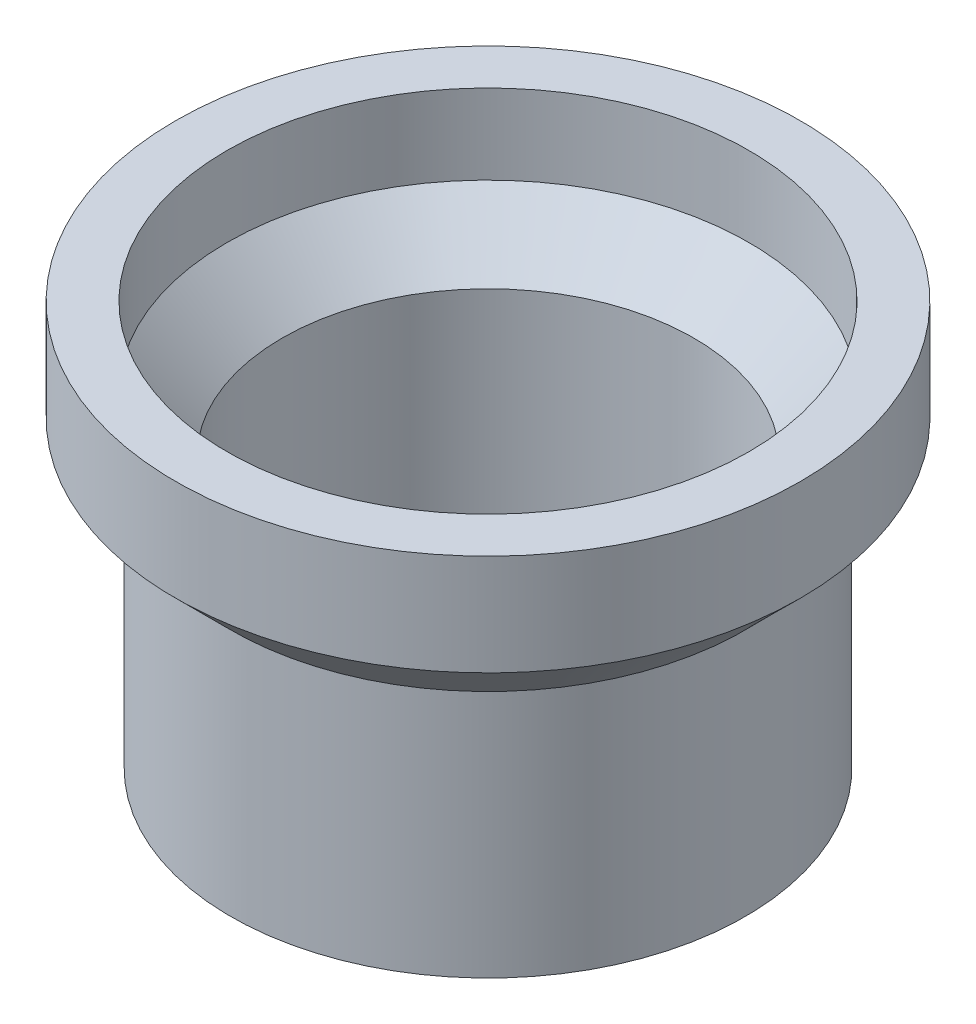
ISO-10303-21;
HEADER;
FILE_DESCRIPTION(('STEP AP214'),'2;1');
FILE_NAME('part.step','',(''),(''),'','','');
FILE_SCHEMA(('AUTOMOTIVE_DESIGN { 1 0 10303 214 1 1 1 1 }'));
ENDSEC;
DATA;
#1=APPLICATION_CONTEXT('core data for automotive mechanical design processes');
#2=APPLICATION_PROTOCOL_DEFINITION('international standard','automotive_design',2000,#1);
#3=PRODUCT_CONTEXT('',#1,'mechanical');
#4=PRODUCT('Part','Part','',(#3));
#5=PRODUCT_RELATED_PRODUCT_CATEGORY('part','',(#4));
#6=PRODUCT_DEFINITION_FORMATION('','',#4);
#7=PRODUCT_DEFINITION_CONTEXT('part definition',#1,'design');
#8=PRODUCT_DEFINITION('design','',#6,#7);
#9=PRODUCT_DEFINITION_SHAPE('','',#8);
#10=(LENGTH_UNIT() NAMED_UNIT(*) SI_UNIT(.MILLI.,.METRE.));
#11=(NAMED_UNIT(*) PLANE_ANGLE_UNIT() SI_UNIT($,.RADIAN.));
#12=(NAMED_UNIT(*) SI_UNIT($,.STERADIAN.) SOLID_ANGLE_UNIT());
#13=UNCERTAINTY_MEASURE_WITH_UNIT(LENGTH_MEASURE(1.E-05),#10,'distance_accuracy_value','');
#14=(GEOMETRIC_REPRESENTATION_CONTEXT(3) GLOBAL_UNCERTAINTY_ASSIGNED_CONTEXT((#13)) GLOBAL_UNIT_ASSIGNED_CONTEXT((#10,
#11,#12)) REPRESENTATION_CONTEXT('',''));
#15=CARTESIAN_POINT('',(0.,0.,0.));
#16=DIRECTION('',(0.,0.,1.));
#17=DIRECTION('',(1.,0.,0.));
#18=AXIS2_PLACEMENT_3D('',#15,#16,#17);
#19=CARTESIAN_POINT('',(14.2,0.,0.));
#20=DIRECTION('',(0.,-1.,0.));
#21=DIRECTION('',(1.,0.,0.));
#22=AXIS2_PLACEMENT_3D('',#19,#20,#21);
#23=PLANE('',#22);
#24=CARTESIAN_POINT('',(0.,0.,0.));
#25=DIRECTION('',(0.,1.,0.));
#26=DIRECTION('',(-1.,0.,0.));
#27=AXIS2_PLACEMENT_3D('',#24,#25,#26);
#28=CIRCLE('',#27,14.2);
#29=CARTESIAN_POINT('',(-14.2,0.,0.));
#30=VERTEX_POINT('',#29);
#31=EDGE_CURVE('E71',#30,#30,#28,.T.);
#32=ORIENTED_EDGE('',*,*,#31,.F.);
#33=EDGE_LOOP('',(#32));
#34=FACE_BOUND('',#33,.T.);
#35=CARTESIAN_POINT('',(0.,0.,0.));
#36=DIRECTION('',(0.,1.,0.));
#37=DIRECTION('',(-1.,0.,0.));
#38=AXIS2_PLACEMENT_3D('',#35,#36,#37);
#39=CIRCLE('',#38,17.);
#40=CARTESIAN_POINT('',(-17.,0.,0.));
#41=VERTEX_POINT('',#40);
#42=EDGE_CURVE('E50',#41,#41,#39,.T.);
#43=ORIENTED_EDGE('',*,*,#42,.T.);
#44=EDGE_LOOP('',(#43));
#45=FACE_BOUND('',#44,.T.);
#46=ADVANCED_FACE('F38',(#34,#45),#23,.F.);
#47=CARTESIAN_POINT('',(0.,16.2794919679964,0.));
#48=DIRECTION('',(0.,1.,0.));
#49=DIRECTION('',(-1.,0.,0.));
#50=AXIS2_PLACEMENT_3D('',#47,#48,#49);
#51=CYLINDRICAL_SURFACE('',#50,17.);
#52=ORIENTED_EDGE('',*,*,#42,.F.);
#53=EDGE_LOOP('',(#52));
#54=FACE_BOUND('',#53,.T.);
#55=CARTESIAN_POINT('',(0.,-5.50000000000001,0.));
#56=DIRECTION('',(0.,1.,0.));
#57=DIRECTION('',(-1.,0.,0.));
#58=AXIS2_PLACEMENT_3D('',#55,#56,#57);
#59=CIRCLE('',#58,17.);
#60=CARTESIAN_POINT('',(-17.,-5.50000000000001,0.));
#61=VERTEX_POINT('',#60);
#62=EDGE_CURVE('E54',#61,#61,#59,.T.);
#63=ORIENTED_EDGE('',*,*,#62,.T.);
#64=EDGE_LOOP('',(#63));
#65=FACE_BOUND('',#64,.T.);
#66=ADVANCED_FACE('F79',(#54,#65),#51,.T.);
#67=CARTESIAN_POINT('',(0.,-8.5,0.));
#68=DIRECTION('',(0.,1.,0.));
#69=DIRECTION('',(-1.,0.,0.));
#70=AXIS2_PLACEMENT_3D('',#67,#68,#69);
#71=CONICAL_SURFACE('',#70,14.,0.78539816339745);
#72=ORIENTED_EDGE('',*,*,#62,.F.);
#73=EDGE_LOOP('',(#72));
#74=FACE_BOUND('',#73,.T.);
#75=CARTESIAN_POINT('',(0.,-8.5,0.));
#76=DIRECTION('',(0.,1.,0.));
#77=DIRECTION('',(-1.,0.,0.));
#78=AXIS2_PLACEMENT_3D('',#75,#76,#77);
#79=CIRCLE('',#78,14.);
#80=CARTESIAN_POINT('',(-14.,-8.5,0.));
#81=VERTEX_POINT('',#80);
#82=EDGE_CURVE('E59',#81,#81,#79,.T.);
#83=ORIENTED_EDGE('',*,*,#82,.T.);
#84=EDGE_LOOP('',(#83));
#85=FACE_BOUND('',#84,.T.);
#86=ADVANCED_FACE('F84',(#74,#85),#71,.T.);
#87=CARTESIAN_POINT('',(0.,16.2794919679964,0.));
#88=DIRECTION('',(0.,1.,0.));
#89=DIRECTION('',(-1.,0.,0.));
#90=AXIS2_PLACEMENT_3D('',#87,#88,#89);
#91=CYLINDRICAL_SURFACE('',#90,14.);
#92=ORIENTED_EDGE('',*,*,#82,.F.);
#93=EDGE_LOOP('',(#92));
#94=FACE_BOUND('',#93,.T.);
#95=CARTESIAN_POINT('',(0.,-22.,0.));
#96=DIRECTION('',(0.,1.,0.));
#97=DIRECTION('',(-1.,0.,0.));
#98=AXIS2_PLACEMENT_3D('',#95,#96,#97);
#99=CIRCLE('',#98,14.);
#100=CARTESIAN_POINT('',(-14.,-22.,0.));
#101=VERTEX_POINT('',#100);
#102=EDGE_CURVE('E62',#101,#101,#99,.T.);
#103=ORIENTED_EDGE('',*,*,#102,.T.);
#104=EDGE_LOOP('',(#103));
#105=FACE_BOUND('',#104,.T.);
#106=ADVANCED_FACE('F90',(#94,#105),#91,.T.);
#107=CARTESIAN_POINT('',(11.2,-22.,0.));
#108=DIRECTION('',(0.,1.,0.));
#109=DIRECTION('',(-1.,0.,0.));
#110=AXIS2_PLACEMENT_3D('',#107,#108,#109);
#111=PLANE('',#110);
#112=CARTESIAN_POINT('',(0.,-22.,0.));
#113=DIRECTION('',(0.,1.,0.));
#114=DIRECTION('',(-1.,0.,0.));
#115=AXIS2_PLACEMENT_3D('',#112,#113,#114);
#116=CIRCLE('',#115,13.2);
#117=CARTESIAN_POINT('',(-13.2,-22.,0.));
#118=VERTEX_POINT('',#117);
#119=EDGE_CURVE('E46',#118,#118,#116,.T.);
#120=ORIENTED_EDGE('',*,*,#119,.T.);
#121=EDGE_LOOP('',(#120));
#122=FACE_BOUND('',#121,.T.);
#123=ORIENTED_EDGE('',*,*,#102,.F.);
#124=EDGE_LOOP('',(#123));
#125=FACE_BOUND('',#124,.T.);
#126=ADVANCED_FACE('F96',(#122,#125),#111,.F.);
#127=CARTESIAN_POINT('',(0.,16.2794919679964,0.));
#128=DIRECTION('',(0.,1.,0.));
#129=DIRECTION('',(-1.,0.,0.));
#130=AXIS2_PLACEMENT_3D('',#127,#128,#129);
#131=CYLINDRICAL_SURFACE('',#130,11.2);
#132=CARTESIAN_POINT('',(0.,-20.,0.));
#133=DIRECTION('',(0.,1.,0.));
#134=DIRECTION('',(-1.,0.,0.));
#135=AXIS2_PLACEMENT_3D('',#132,#133,#134);
#136=CIRCLE('',#135,11.2);
#137=CARTESIAN_POINT('',(-11.2,-20.,0.));
#138=VERTEX_POINT('',#137);
#139=EDGE_CURVE('E10',#138,#138,#136,.F.);
#140=ORIENTED_EDGE('',*,*,#139,.T.);
#141=EDGE_LOOP('',(#140));
#142=FACE_BOUND('',#141,.T.);
#143=CARTESIAN_POINT('',(0.,-7.34020202535534,0.));
#144=DIRECTION('',(0.,1.,0.));
#145=DIRECTION('',(-1.,0.,0.));
#146=AXIS2_PLACEMENT_3D('',#143,#144,#145);
#147=CIRCLE('',#146,11.2);
#148=CARTESIAN_POINT('',(-11.2,-7.34020202535534,0.));
#149=VERTEX_POINT('',#148);
#150=EDGE_CURVE('E65',#149,#149,#147,.T.);
#151=ORIENTED_EDGE('',*,*,#150,.T.);
#152=EDGE_LOOP('',(#151));
#153=FACE_BOUND('',#152,.T.);
#154=ADVANCED_FACE('F101',(#142,#153),#131,.F.);
#155=CARTESIAN_POINT('',(0.,-4.34020202535534,0.));
#156=DIRECTION('',(0.,1.,0.));
#157=DIRECTION('',(-1.,0.,0.));
#158=AXIS2_PLACEMENT_3D('',#155,#156,#157);
#159=CONICAL_SURFACE('',#158,14.2,0.785398163397449);
#160=ORIENTED_EDGE('',*,*,#150,.F.);
#161=EDGE_LOOP('',(#160));
#162=FACE_BOUND('',#161,.T.);
#163=CARTESIAN_POINT('',(0.,-4.34020202535534,0.));
#164=DIRECTION('',(0.,1.,0.));
#165=DIRECTION('',(-1.,0.,0.));
#166=AXIS2_PLACEMENT_3D('',#163,#164,#165);
#167=CIRCLE('',#166,14.2);
#168=CARTESIAN_POINT('',(-14.2,-4.34020202535534,0.));
#169=VERTEX_POINT('',#168);
#170=EDGE_CURVE('E68',#169,#169,#167,.T.);
#171=ORIENTED_EDGE('',*,*,#170,.T.);
#172=EDGE_LOOP('',(#171));
#173=FACE_BOUND('',#172,.T.);
#174=ADVANCED_FACE('F106',(#162,#173),#159,.F.);
#175=CARTESIAN_POINT('',(0.,16.2794919679964,0.));
#176=DIRECTION('',(0.,1.,0.));
#177=DIRECTION('',(-1.,0.,0.));
#178=AXIS2_PLACEMENT_3D('',#175,#176,#177);
#179=CYLINDRICAL_SURFACE('',#178,14.2);
#180=ORIENTED_EDGE('',*,*,#170,.F.);
#181=EDGE_LOOP('',(#180));
#182=FACE_BOUND('',#181,.T.);
#183=ORIENTED_EDGE('',*,*,#31,.T.);
#184=EDGE_LOOP('',(#183));
#185=FACE_BOUND('',#184,.T.);
#186=ADVANCED_FACE('F75',(#182,#185),#179,.F.);
#187=CARTESIAN_POINT('',(0.,-22.,0.));
#188=DIRECTION('',(0.,-1.,0.));
#189=DIRECTION('',(1.,0.,0.));
#190=AXIS2_PLACEMENT_3D('',#187,#188,#189);
#191=CONICAL_SURFACE('',#190,13.2,0.785398163397446);
#192=ORIENTED_EDGE('',*,*,#139,.F.);
#193=EDGE_LOOP('',(#192));
#194=FACE_BOUND('',#193,.T.);
#195=ORIENTED_EDGE('',*,*,#119,.F.);
#196=EDGE_LOOP('',(#195));
#197=FACE_BOUND('',#196,.T.);
#198=ADVANCED_FACE('F41',(#194,#197),#191,.F.);
#199=CLOSED_SHELL('',(#46,#66,#86,#106,#126,#154,#174,#186,#198));
#200=MANIFOLD_SOLID_BREP('B2',#199);
#201=ADVANCED_BREP_SHAPE_REPRESENTATION('',(#18,#200),#14);
#202=SHAPE_DEFINITION_REPRESENTATION(#9,#201);
ENDSEC;
END-ISO-10303-21;
